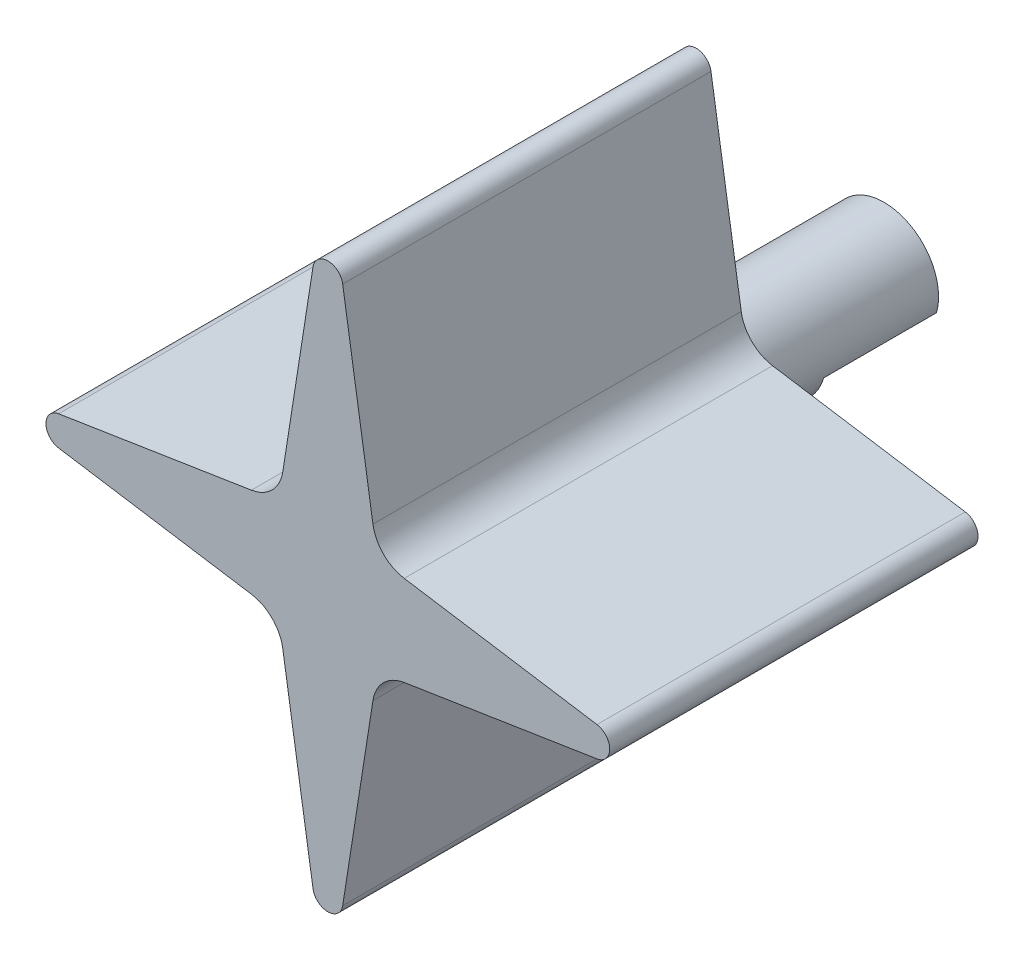
ISO-10303-21;
HEADER;
FILE_DESCRIPTION(('STEP AP214'),'2;1');
FILE_NAME('part.step','',(''),(''),'','','');
FILE_SCHEMA(('AUTOMOTIVE_DESIGN { 1 0 10303 214 1 1 1 1 }'));
ENDSEC;
DATA;
#1=APPLICATION_CONTEXT('core data for automotive mechanical design processes');
#2=APPLICATION_PROTOCOL_DEFINITION('international standard','automotive_design',2000,#1);
#3=PRODUCT_CONTEXT('',#1,'mechanical');
#4=PRODUCT('Part','Part','',(#3));
#5=PRODUCT_RELATED_PRODUCT_CATEGORY('part','',(#4));
#6=PRODUCT_DEFINITION_FORMATION('','',#4);
#7=PRODUCT_DEFINITION_CONTEXT('part definition',#1,'design');
#8=PRODUCT_DEFINITION('design','',#6,#7);
#9=PRODUCT_DEFINITION_SHAPE('','',#8);
#10=(LENGTH_UNIT() NAMED_UNIT(*) SI_UNIT(.MILLI.,.METRE.));
#11=(NAMED_UNIT(*) PLANE_ANGLE_UNIT() SI_UNIT($,.RADIAN.));
#12=(NAMED_UNIT(*) SI_UNIT($,.STERADIAN.) SOLID_ANGLE_UNIT());
#13=UNCERTAINTY_MEASURE_WITH_UNIT(LENGTH_MEASURE(1.E-05),#10,'distance_accuracy_value','');
#14=(GEOMETRIC_REPRESENTATION_CONTEXT(3) GLOBAL_UNCERTAINTY_ASSIGNED_CONTEXT((#13)) GLOBAL_UNIT_ASSIGNED_CONTEXT((#10,
#11,#12)) REPRESENTATION_CONTEXT('',''));
#15=CARTESIAN_POINT('',(0.,0.,0.));
#16=DIRECTION('',(0.,0.,1.));
#17=DIRECTION('',(1.,0.,0.));
#18=AXIS2_PLACEMENT_3D('',#15,#16,#17);
#19=CARTESIAN_POINT('',(-35.5,3.70975400848805E-13,49.));
#20=DIRECTION('',(0.,0.,-1.));
#21=DIRECTION('',(-1.,0.,0.));
#22=AXIS2_PLACEMENT_3D('',#19,#20,#21);
#23=CYLINDRICAL_SURFACE('',#22,2.);
#24=CARTESIAN_POINT('',(-35.5,3.70975400848805E-13,0.));
#25=DIRECTION('',(0.,0.,1.));
#26=DIRECTION('',(1.,0.,0.));
#27=AXIS2_PLACEMENT_3D('',#24,#25,#26);
#28=CIRCLE('',#27,2.);
#29=CARTESIAN_POINT('',(-35.8098591549296,-1.97585103287289,0.));
#30=VERTEX_POINT('',#29);
#31=CARTESIAN_POINT('',(-35.8098591549296,1.97585103287363,0.));
#32=VERTEX_POINT('',#31);
#33=EDGE_CURVE('E188',#30,#32,#28,.F.);
#34=ORIENTED_EDGE('',*,*,#33,.F.);
#35=DIRECTION('',(0.,0.,-1.));
#36=VECTOR('',#35,1.);
#37=CARTESIAN_POINT('',(-35.8098591549296,-1.97585103287289,49.));
#38=LINE('',#37,#36);
#39=CARTESIAN_POINT('',(-35.8098591549296,-1.97585103287289,49.));
#40=VERTEX_POINT('',#39);
#41=EDGE_CURVE('E269',#40,#30,#38,.T.);
#42=ORIENTED_EDGE('',*,*,#41,.F.);
#43=CARTESIAN_POINT('',(-35.5,3.70975400848805E-13,49.));
#44=DIRECTION('',(0.,0.,1.));
#45=DIRECTION('',(1.,0.,0.));
#46=AXIS2_PLACEMENT_3D('',#43,#44,#45);
#47=CIRCLE('',#46,2.);
#48=CARTESIAN_POINT('',(-35.8098591549296,1.97585103287363,49.));
#49=VERTEX_POINT('',#48);
#50=EDGE_CURVE('E189',#40,#49,#47,.F.);
#51=ORIENTED_EDGE('',*,*,#50,.T.);
#52=DIRECTION('',(0.,0.,-1.));
#53=VECTOR('',#52,1.);
#54=CARTESIAN_POINT('',(-35.8098591549296,1.97585103287363,49.));
#55=LINE('',#54,#53);
#56=EDGE_CURVE('E222',#49,#32,#55,.T.);
#57=ORIENTED_EDGE('',*,*,#56,.T.);
#58=EDGE_LOOP('',(#34,#42,#51,#57));
#59=FACE_BOUND('',#58,.T.);
#60=ADVANCED_FACE('F41',(#59),#23,.T.);
#61=CARTESIAN_POINT('',(-1.16197183098603,-7.40944137327481,49.));
#62=DIRECTION('',(-0.154929577464802,-0.987925516436628,0.));
#63=DIRECTION('',(0.987925516436628,-0.154929577464802,0.));
#64=AXIS2_PLACEMENT_3D('',#61,#62,#63);
#65=PLANE('',#64);
#66=DIRECTION('',(-0.987925516436628,0.154929577464802,0.));
#67=VECTOR('',#66,1.);
#68=CARTESIAN_POINT('',(-1.16197183098603,-7.40944137327481,0.));
#69=LINE('',#68,#67);
#70=CARTESIAN_POINT('',(-10.1628717218579,-5.99789202699855,0.));
#71=VERTEX_POINT('',#70);
#72=EDGE_CURVE('E225',#71,#30,#69,.T.);
#73=ORIENTED_EDGE('',*,*,#72,.F.);
#74=DIRECTION('',(0.,0.,-1.));
#75=VECTOR('',#74,1.);
#76=CARTESIAN_POINT('',(-10.1628717218579,-5.99789202699855,49.));
#77=LINE('',#76,#75);
#78=CARTESIAN_POINT('',(-10.1628717218579,-5.99789202699855,49.));
#79=VERTEX_POINT('',#78);
#80=EDGE_CURVE('E280',#71,#79,#77,.F.);
#81=ORIENTED_EDGE('',*,*,#80,.T.);
#82=DIRECTION('',(-0.987925516436628,0.154929577464802,0.));
#83=VECTOR('',#82,1.);
#84=CARTESIAN_POINT('',(-1.16197183098603,-7.40944137327481,49.));
#85=LINE('',#84,#83);
#86=EDGE_CURVE('E192',#79,#40,#85,.T.);
#87=ORIENTED_EDGE('',*,*,#86,.T.);
#88=ORIENTED_EDGE('',*,*,#41,.T.);
#89=EDGE_LOOP('',(#73,#81,#87,#88));
#90=FACE_BOUND('',#89,.T.);
#91=ADVANCED_FACE('F353',(#90),#65,.T.);
#92=CARTESIAN_POINT('',(-7.40944137327484,-1.16197183098591,49.));
#93=DIRECTION('',(-0.987925516436631,-0.154929577464785,0.));
#94=DIRECTION('',(0.154929577464785,-0.987925516436631,0.));
#95=AXIS2_PLACEMENT_3D('',#92,#93,#94);
#96=PLANE('',#95);
#97=DIRECTION('',(-0.154929577464785,0.987925516436631,0.));
#98=VECTOR('',#97,1.);
#99=CARTESIAN_POINT('',(-7.40944137327484,-1.16197183098591,49.));
#100=LINE('',#99,#98);
#101=CARTESIAN_POINT('',(-1.97585103287351,-35.8098591549296,49.));
#102=VERTEX_POINT('',#101);
#103=CARTESIAN_POINT('',(-5.99789202699874,-10.1628717218578,49.));
#104=VERTEX_POINT('',#103);
#105=EDGE_CURVE('E195',#102,#104,#100,.T.);
#106=ORIENTED_EDGE('',*,*,#105,.T.);
#107=DIRECTION('',(0.,0.,-1.));
#108=VECTOR('',#107,1.);
#109=CARTESIAN_POINT('',(-5.99789202699874,-10.1628717218578,0.));
#110=LINE('',#109,#108);
#111=CARTESIAN_POINT('',(-5.99789202699874,-10.1628717218578,0.));
#112=VERTEX_POINT('',#111);
#113=EDGE_CURVE('E277',#104,#112,#110,.T.);
#114=ORIENTED_EDGE('',*,*,#113,.T.);
#115=DIRECTION('',(-0.154929577464785,0.987925516436631,0.));
#116=VECTOR('',#115,1.);
#117=CARTESIAN_POINT('',(-7.40944137327484,-1.16197183098591,0.));
#118=LINE('',#117,#116);
#119=CARTESIAN_POINT('',(-1.97585103287351,-35.8098591549296,0.));
#120=VERTEX_POINT('',#119);
#121=EDGE_CURVE('E227',#120,#112,#118,.T.);
#122=ORIENTED_EDGE('',*,*,#121,.F.);
#123=DIRECTION('',(0.,0.,-1.));
#124=VECTOR('',#123,1.);
#125=CARTESIAN_POINT('',(-1.97585103287351,-35.8098591549296,49.));
#126=LINE('',#125,#124);
#127=EDGE_CURVE('E267',#102,#120,#126,.T.);
#128=ORIENTED_EDGE('',*,*,#127,.F.);
#129=EDGE_LOOP('',(#106,#114,#122,#128));
#130=FACE_BOUND('',#129,.T.);
#131=ADVANCED_FACE('F345',(#130),#96,.T.);
#132=CARTESIAN_POINT('',(-2.46160451581886E-13,-35.5,49.));
#133=DIRECTION('',(0.,0.,-1.));
#134=DIRECTION('',(-1.,0.,0.));
#135=AXIS2_PLACEMENT_3D('',#132,#133,#134);
#136=CYLINDRICAL_SURFACE('',#135,2.);
#137=CARTESIAN_POINT('',(-2.46160451581886E-13,-35.5,0.));
#138=DIRECTION('',(0.,0.,1.));
#139=DIRECTION('',(1.,0.,0.));
#140=AXIS2_PLACEMENT_3D('',#137,#138,#139);
#141=CIRCLE('',#140,2.);
#142=CARTESIAN_POINT('',(1.97585103287301,-35.8098591549296,0.));
#143=VERTEX_POINT('',#142);
#144=EDGE_CURVE('E230',#143,#120,#141,.F.);
#145=ORIENTED_EDGE('',*,*,#144,.F.);
#146=DIRECTION('',(0.,0.,-1.));
#147=VECTOR('',#146,1.);
#148=CARTESIAN_POINT('',(1.97585103287301,-35.8098591549296,49.));
#149=LINE('',#148,#147);
#150=CARTESIAN_POINT('',(1.97585103287301,-35.8098591549296,49.));
#151=VERTEX_POINT('',#150);
#152=EDGE_CURVE('E264',#151,#143,#149,.T.);
#153=ORIENTED_EDGE('',*,*,#152,.F.);
#154=CARTESIAN_POINT('',(-2.46160451581886E-13,-35.5,49.));
#155=DIRECTION('',(0.,0.,1.));
#156=DIRECTION('',(1.,0.,0.));
#157=AXIS2_PLACEMENT_3D('',#154,#155,#156);
#158=CIRCLE('',#157,2.);
#159=EDGE_CURVE('E198',#151,#102,#158,.F.);
#160=ORIENTED_EDGE('',*,*,#159,.T.);
#161=ORIENTED_EDGE('',*,*,#127,.T.);
#162=EDGE_LOOP('',(#145,#153,#160,#161));
#163=FACE_BOUND('',#162,.T.);
#164=ADVANCED_FACE('F341',(#163),#136,.T.);
#165=CARTESIAN_POINT('',(7.4094413732741,-1.16197183098573,49.));
#166=DIRECTION('',(0.987925516436632,-0.154929577464778,0.));
#167=DIRECTION('',(0.154929577464778,0.987925516436632,0.));
#168=AXIS2_PLACEMENT_3D('',#165,#166,#167);
#169=PLANE('',#168);
#170=DIRECTION('',(-0.154929577464778,-0.987925516436632,0.));
#171=VECTOR('',#170,1.);
#172=CARTESIAN_POINT('',(7.4094413732741,-1.16197183098573,0.));
#173=LINE('',#172,#171);
#174=CARTESIAN_POINT('',(5.99789202699803,-10.1628717218578,0.));
#175=VERTEX_POINT('',#174);
#176=EDGE_CURVE('E233',#175,#143,#173,.T.);
#177=ORIENTED_EDGE('',*,*,#176,.F.);
#178=DIRECTION('',(0.,0.,-1.));
#179=VECTOR('',#178,1.);
#180=CARTESIAN_POINT('',(5.99789202699803,-10.1628717218578,49.));
#181=LINE('',#180,#179);
#182=CARTESIAN_POINT('',(5.99789202699803,-10.1628717218578,49.));
#183=VERTEX_POINT('',#182);
#184=EDGE_CURVE('E285',#175,#183,#181,.F.);
#185=ORIENTED_EDGE('',*,*,#184,.T.);
#186=DIRECTION('',(-0.154929577464778,-0.987925516436632,0.));
#187=VECTOR('',#186,1.);
#188=CARTESIAN_POINT('',(7.4094413732741,-1.16197183098573,49.));
#189=LINE('',#188,#187);
#190=EDGE_CURVE('E201',#183,#151,#189,.T.);
#191=ORIENTED_EDGE('',*,*,#190,.T.);
#192=ORIENTED_EDGE('',*,*,#152,.T.);
#193=EDGE_LOOP('',(#177,#185,#191,#192));
#194=FACE_BOUND('',#193,.T.);
#195=ADVANCED_FACE('F335',(#194),#169,.T.);
#196=CARTESIAN_POINT('',(1.16197183098583,-7.40944137327457,49.));
#197=DIRECTION('',(0.15492957746478,-0.987925516436631,0.));
#198=DIRECTION('',(0.987925516436631,0.15492957746478,0.));
#199=AXIS2_PLACEMENT_3D('',#196,#197,#198);
#200=PLANE('',#199);
#201=DIRECTION('',(-0.987925516436631,-0.15492957746478,0.));
#202=VECTOR('',#201,1.);
#203=CARTESIAN_POINT('',(1.16197183098583,-7.40944137327457,49.));
#204=LINE('',#203,#202);
#205=CARTESIAN_POINT('',(35.8098591549296,-1.97585103287339,49.));
#206=VERTEX_POINT('',#205);
#207=CARTESIAN_POINT('',(10.1628717218573,-5.99789202699857,49.));
#208=VERTEX_POINT('',#207);
#209=EDGE_CURVE('E203',#206,#208,#204,.T.);
#210=ORIENTED_EDGE('',*,*,#209,.T.);
#211=DIRECTION('',(0.,0.,-1.));
#212=VECTOR('',#211,1.);
#213=CARTESIAN_POINT('',(10.1628717218573,-5.99789202699857,0.));
#214=LINE('',#213,#212);
#215=CARTESIAN_POINT('',(10.1628717218573,-5.99789202699857,0.));
#216=VERTEX_POINT('',#215);
#217=EDGE_CURVE('E282',#208,#216,#214,.T.);
#218=ORIENTED_EDGE('',*,*,#217,.T.);
#219=DIRECTION('',(-0.987925516436631,-0.15492957746478,0.));
#220=VECTOR('',#219,1.);
#221=CARTESIAN_POINT('',(1.16197183098583,-7.40944137327457,0.));
#222=LINE('',#221,#220);
#223=CARTESIAN_POINT('',(35.8098591549296,-1.97585103287339,0.));
#224=VERTEX_POINT('',#223);
#225=EDGE_CURVE('E235',#224,#216,#222,.T.);
#226=ORIENTED_EDGE('',*,*,#225,.F.);
#227=DIRECTION('',(0.,0.,-1.));
#228=VECTOR('',#227,1.);
#229=CARTESIAN_POINT('',(35.8098591549296,-1.97585103287339,49.));
#230=LINE('',#229,#228);
#231=EDGE_CURVE('E262',#206,#224,#230,.T.);
#232=ORIENTED_EDGE('',*,*,#231,.F.);
#233=EDGE_LOOP('',(#210,#218,#226,#232));
#234=FACE_BOUND('',#233,.T.);
#235=ADVANCED_FACE('F326',(#234),#200,.T.);
#236=CARTESIAN_POINT('',(35.5,-1.25682311004908E-13,49.));
#237=DIRECTION('',(0.,0.,-1.));
#238=DIRECTION('',(-1.,0.,0.));
#239=AXIS2_PLACEMENT_3D('',#236,#237,#238);
#240=CYLINDRICAL_SURFACE('',#239,2.);
#241=CARTESIAN_POINT('',(35.5,-1.25682311004908E-13,0.));
#242=DIRECTION('',(0.,0.,1.));
#243=DIRECTION('',(1.,0.,0.));
#244=AXIS2_PLACEMENT_3D('',#241,#242,#243);
#245=CIRCLE('',#244,2.);
#246=CARTESIAN_POINT('',(35.8098591549296,1.97585103287313,0.));
#247=VERTEX_POINT('',#246);
#248=EDGE_CURVE('E238',#247,#224,#245,.F.);
#249=ORIENTED_EDGE('',*,*,#248,.F.);
#250=DIRECTION('',(0.,0.,-1.));
#251=VECTOR('',#250,1.);
#252=CARTESIAN_POINT('',(35.8098591549296,1.97585103287313,49.));
#253=LINE('',#252,#251);
#254=CARTESIAN_POINT('',(35.8098591549296,1.97585103287313,49.));
#255=VERTEX_POINT('',#254);
#256=EDGE_CURVE('E259',#255,#247,#253,.T.);
#257=ORIENTED_EDGE('',*,*,#256,.F.);
#258=CARTESIAN_POINT('',(35.5,-1.25682311004908E-13,49.));
#259=DIRECTION('',(0.,0.,1.));
#260=DIRECTION('',(1.,0.,0.));
#261=AXIS2_PLACEMENT_3D('',#258,#259,#260);
#262=CIRCLE('',#261,2.);
#263=EDGE_CURVE('E206',#255,#206,#262,.F.);
#264=ORIENTED_EDGE('',*,*,#263,.T.);
#265=ORIENTED_EDGE('',*,*,#231,.T.);
#266=EDGE_LOOP('',(#249,#257,#264,#265));
#267=FACE_BOUND('',#266,.T.);
#268=ADVANCED_FACE('F322',(#267),#240,.T.);
#269=CARTESIAN_POINT('',(1.1619718309859,7.4094413732746,49.));
#270=DIRECTION('',(0.154929577464789,0.98792551643663,0.));
#271=DIRECTION('',(-0.98792551643663,0.154929577464789,0.));
#272=AXIS2_PLACEMENT_3D('',#269,#270,#271);
#273=PLANE('',#272);
#274=DIRECTION('',(0.98792551643663,-0.154929577464789,0.));
#275=VECTOR('',#274,1.);
#276=CARTESIAN_POINT('',(1.1619718309859,7.4094413732746,0.));
#277=LINE('',#276,#275);
#278=CARTESIAN_POINT('',(10.1628717218578,5.99789202699846,0.));
#279=VERTEX_POINT('',#278);
#280=EDGE_CURVE('E241',#279,#247,#277,.T.);
#281=ORIENTED_EDGE('',*,*,#280,.F.);
#282=DIRECTION('',(0.,0.,-1.));
#283=VECTOR('',#282,1.);
#284=CARTESIAN_POINT('',(10.1628717218578,5.99789202699846,49.));
#285=LINE('',#284,#283);
#286=CARTESIAN_POINT('',(10.1628717218578,5.99789202699846,49.));
#287=VERTEX_POINT('',#286);
#288=EDGE_CURVE('E64',#279,#287,#285,.F.);
#289=ORIENTED_EDGE('',*,*,#288,.T.);
#290=DIRECTION('',(0.98792551643663,-0.154929577464789,0.));
#291=VECTOR('',#290,1.);
#292=CARTESIAN_POINT('',(1.1619718309859,7.4094413732746,49.));
#293=LINE('',#292,#291);
#294=EDGE_CURVE('E209',#287,#255,#293,.T.);
#295=ORIENTED_EDGE('',*,*,#294,.T.);
#296=ORIENTED_EDGE('',*,*,#256,.T.);
#297=EDGE_LOOP('',(#281,#289,#295,#296));
#298=FACE_BOUND('',#297,.T.);
#299=ADVANCED_FACE('F318',(#298),#273,.T.);
#300=CARTESIAN_POINT('',(7.40944137327472,1.16197183098592,49.));
#301=DIRECTION('',(0.98792551643663,0.154929577464789,0.));
#302=DIRECTION('',(-0.154929577464789,0.98792551643663,0.));
#303=AXIS2_PLACEMENT_3D('',#300,#301,#302);
#304=PLANE('',#303);
#305=DIRECTION('',(0.154929577464789,-0.98792551643663,0.));
#306=VECTOR('',#305,1.);
#307=CARTESIAN_POINT('',(7.40944137327472,1.16197183098592,49.));
#308=LINE('',#307,#306);
#309=CARTESIAN_POINT('',(1.97585103287326,35.8098591549296,49.));
#310=VERTEX_POINT('',#309);
#311=CARTESIAN_POINT('',(5.9978920269986,10.1628717218577,49.));
#312=VERTEX_POINT('',#311);
#313=EDGE_CURVE('E211',#310,#312,#308,.T.);
#314=ORIENTED_EDGE('',*,*,#313,.T.);
#315=DIRECTION('',(0.,0.,-1.));
#316=VECTOR('',#315,1.);
#317=CARTESIAN_POINT('',(5.9978920269986,10.1628717218577,0.));
#318=LINE('',#317,#316);
#319=CARTESIAN_POINT('',(5.9978920269986,10.1628717218577,0.));
#320=VERTEX_POINT('',#319);
#321=EDGE_CURVE('E287',#312,#320,#318,.T.);
#322=ORIENTED_EDGE('',*,*,#321,.T.);
#323=DIRECTION('',(0.154929577464789,-0.98792551643663,0.));
#324=VECTOR('',#323,1.);
#325=CARTESIAN_POINT('',(7.40944137327472,1.16197183098592,0.));
#326=LINE('',#325,#324);
#327=CARTESIAN_POINT('',(1.97585103287326,35.8098591549296,0.));
#328=VERTEX_POINT('',#327);
#329=EDGE_CURVE('E243',#328,#320,#326,.T.);
#330=ORIENTED_EDGE('',*,*,#329,.F.);
#331=DIRECTION('',(0.,0.,-1.));
#332=VECTOR('',#331,1.);
#333=CARTESIAN_POINT('',(1.97585103287326,35.8098591549296,49.));
#334=LINE('',#333,#332);
#335=EDGE_CURVE('E257',#310,#328,#334,.T.);
#336=ORIENTED_EDGE('',*,*,#335,.F.);
#337=EDGE_LOOP('',(#314,#322,#330,#336));
#338=FACE_BOUND('',#337,.T.);
#339=ADVANCED_FACE('F314',(#338),#304,.T.);
#340=CARTESIAN_POINT('',(0.,35.5,49.));
#341=DIRECTION('',(0.,0.,-1.));
#342=DIRECTION('',(-1.,0.,0.));
#343=AXIS2_PLACEMENT_3D('',#340,#341,#342);
#344=CYLINDRICAL_SURFACE('',#343,2.);
#345=CARTESIAN_POINT('',(0.,35.5,0.));
#346=DIRECTION('',(0.,0.,1.));
#347=DIRECTION('',(1.,0.,0.));
#348=AXIS2_PLACEMENT_3D('',#345,#346,#347);
#349=CIRCLE('',#348,2.);
#350=CARTESIAN_POINT('',(-1.97585103287326,35.8098591549296,0.));
#351=VERTEX_POINT('',#350);
#352=EDGE_CURVE('E246',#351,#328,#349,.F.);
#353=ORIENTED_EDGE('',*,*,#352,.F.);
#354=DIRECTION('',(0.,0.,-1.));
#355=VECTOR('',#354,1.);
#356=CARTESIAN_POINT('',(-1.97585103287326,35.8098591549296,49.));
#357=LINE('',#356,#355);
#358=CARTESIAN_POINT('',(-1.97585103287326,35.8098591549296,49.));
#359=VERTEX_POINT('',#358);
#360=EDGE_CURVE('E254',#359,#351,#357,.T.);
#361=ORIENTED_EDGE('',*,*,#360,.F.);
#362=CARTESIAN_POINT('',(0.,35.5,49.));
#363=DIRECTION('',(0.,0.,1.));
#364=DIRECTION('',(1.,0.,0.));
#365=AXIS2_PLACEMENT_3D('',#362,#363,#364);
#366=CIRCLE('',#365,2.);
#367=EDGE_CURVE('E214',#359,#310,#366,.F.);
#368=ORIENTED_EDGE('',*,*,#367,.T.);
#369=ORIENTED_EDGE('',*,*,#335,.T.);
#370=EDGE_LOOP('',(#353,#361,#368,#369));
#371=FACE_BOUND('',#370,.T.);
#372=ADVANCED_FACE('F373',(#371),#344,.T.);
#373=CARTESIAN_POINT('',(-7.40944137327472,1.16197183098591,49.));
#374=DIRECTION('',(-0.98792551643663,0.154929577464789,0.));
#375=DIRECTION('',(-0.154929577464789,-0.98792551643663,0.));
#376=AXIS2_PLACEMENT_3D('',#373,#374,#375);
#377=PLANE('',#376);
#378=DIRECTION('',(0.154929577464789,0.98792551643663,0.));
#379=VECTOR('',#378,1.);
#380=CARTESIAN_POINT('',(-7.40944137327472,1.16197183098591,0.));
#381=LINE('',#380,#379);
#382=CARTESIAN_POINT('',(-5.99789202699857,10.1628717218579,0.));
#383=VERTEX_POINT('',#382);
#384=EDGE_CURVE('E249',#383,#351,#381,.T.);
#385=ORIENTED_EDGE('',*,*,#384,.F.);
#386=DIRECTION('',(0.,0.,-1.));
#387=VECTOR('',#386,1.);
#388=CARTESIAN_POINT('',(-5.99789202699857,10.1628717218579,49.));
#389=LINE('',#388,#387);
#390=CARTESIAN_POINT('',(-5.99789202699857,10.1628717218579,49.));
#391=VERTEX_POINT('',#390);
#392=EDGE_CURVE('E275',#383,#391,#389,.F.);
#393=ORIENTED_EDGE('',*,*,#392,.T.);
#394=DIRECTION('',(0.154929577464789,0.98792551643663,0.));
#395=VECTOR('',#394,1.);
#396=CARTESIAN_POINT('',(-7.40944137327472,1.16197183098591,49.));
#397=LINE('',#396,#395);
#398=EDGE_CURVE('E217',#391,#359,#397,.T.);
#399=ORIENTED_EDGE('',*,*,#398,.T.);
#400=ORIENTED_EDGE('',*,*,#360,.T.);
#401=EDGE_LOOP('',(#385,#393,#399,#400));
#402=FACE_BOUND('',#401,.T.);
#403=ADVANCED_FACE('F368',(#402),#377,.T.);
#404=CARTESIAN_POINT('',(-1.16197183098582,7.40944137327469,49.));
#405=DIRECTION('',(-0.154929577464777,0.987925516436632,0.));
#406=DIRECTION('',(-0.987925516436632,-0.154929577464777,0.));
#407=AXIS2_PLACEMENT_3D('',#404,#405,#406);
#408=PLANE('',#407);
#409=DIRECTION('',(0.987925516436632,0.154929577464777,0.));
#410=VECTOR('',#409,1.);
#411=CARTESIAN_POINT('',(-1.16197183098582,7.40944137327469,49.));
#412=LINE('',#411,#410);
#413=CARTESIAN_POINT('',(-10.1628717218578,5.99789202699864,49.));
#414=VERTEX_POINT('',#413);
#415=EDGE_CURVE('E219',#49,#414,#412,.T.);
#416=ORIENTED_EDGE('',*,*,#415,.T.);
#417=DIRECTION('',(0.,0.,-1.));
#418=VECTOR('',#417,1.);
#419=CARTESIAN_POINT('',(-10.1628717218578,5.99789202699864,0.));
#420=LINE('',#419,#418);
#421=CARTESIAN_POINT('',(-10.1628717218578,5.99789202699864,0.));
#422=VERTEX_POINT('',#421);
#423=EDGE_CURVE('E272',#414,#422,#420,.T.);
#424=ORIENTED_EDGE('',*,*,#423,.T.);
#425=DIRECTION('',(0.987925516436632,0.154929577464777,0.));
#426=VECTOR('',#425,1.);
#427=CARTESIAN_POINT('',(-1.16197183098582,7.40944137327469,0.));
#428=LINE('',#427,#426);
#429=EDGE_CURVE('E193',#32,#422,#428,.T.);
#430=ORIENTED_EDGE('',*,*,#429,.F.);
#431=ORIENTED_EDGE('',*,*,#56,.F.);
#432=EDGE_LOOP('',(#416,#424,#430,#431));
#433=FACE_BOUND('',#432,.T.);
#434=ADVANCED_FACE('F360',(#433),#408,.T.);
#435=CARTESIAN_POINT('',(0.,0.,49.));
#436=DIRECTION('',(0.,0.,1.));
#437=DIRECTION('',(1.,0.,0.));
#438=AXIS2_PLACEMENT_3D('',#435,#436,#437);
#439=PLANE('',#438);
#440=ORIENTED_EDGE('',*,*,#50,.F.);
#441=ORIENTED_EDGE('',*,*,#86,.F.);
#442=CARTESIAN_POINT('',(-10.9375196091819,-10.9375196091817,49.));
#443=DIRECTION('',(0.,0.,1.));
#444=DIRECTION('',(1.,0.,0.));
#445=AXIS2_PLACEMENT_3D('',#442,#443,#444);
#446=CIRCLE('',#445,5.);
#447=EDGE_CURVE('E297',#79,#104,#446,.F.);
#448=ORIENTED_EDGE('',*,*,#447,.T.);
#449=ORIENTED_EDGE('',*,*,#105,.F.);
#450=ORIENTED_EDGE('',*,*,#159,.F.);
#451=ORIENTED_EDGE('',*,*,#190,.F.);
#452=CARTESIAN_POINT('',(10.9375196091812,-10.9375196091817,49.));
#453=DIRECTION('',(0.,0.,1.));
#454=DIRECTION('',(1.,0.,0.));
#455=AXIS2_PLACEMENT_3D('',#452,#453,#454);
#456=CIRCLE('',#455,5.);
#457=EDGE_CURVE('E301',#183,#208,#456,.F.);
#458=ORIENTED_EDGE('',*,*,#457,.T.);
#459=ORIENTED_EDGE('',*,*,#209,.F.);
#460=ORIENTED_EDGE('',*,*,#263,.F.);
#461=ORIENTED_EDGE('',*,*,#294,.F.);
#462=CARTESIAN_POINT('',(10.9375196091818,10.9375196091816,49.));
#463=DIRECTION('',(0.,0.,1.));
#464=DIRECTION('',(1.,0.,0.));
#465=AXIS2_PLACEMENT_3D('',#462,#463,#464);
#466=CIRCLE('',#465,5.);
#467=EDGE_CURVE('E49',#287,#312,#466,.F.);
#468=ORIENTED_EDGE('',*,*,#467,.T.);
#469=ORIENTED_EDGE('',*,*,#313,.F.);
#470=ORIENTED_EDGE('',*,*,#367,.F.);
#471=ORIENTED_EDGE('',*,*,#398,.F.);
#472=CARTESIAN_POINT('',(-10.9375196091817,10.9375196091818,49.));
#473=DIRECTION('',(0.,0.,1.));
#474=DIRECTION('',(1.,0.,0.));
#475=AXIS2_PLACEMENT_3D('',#472,#473,#474);
#476=CIRCLE('',#475,5.);
#477=EDGE_CURVE('E293',#391,#414,#476,.F.);
#478=ORIENTED_EDGE('',*,*,#477,.T.);
#479=ORIENTED_EDGE('',*,*,#415,.F.);
#480=EDGE_LOOP('',(#440,#441,#448,#449,#450,#451,#458,#459,#460,#461,#468,#469,#470,#471,#478,#479));
#481=FACE_BOUND('',#480,.T.);
#482=ADVANCED_FACE('F308',(#481),#439,.T.);
#483=CARTESIAN_POINT('',(0.,0.,0.));
#484=DIRECTION('',(0.,0.,1.));
#485=DIRECTION('',(1.,0.,0.));
#486=AXIS2_PLACEMENT_3D('',#483,#484,#485);
#487=PLANE('',#486);
#488=CARTESIAN_POINT('',(-2.56739074444567E-13,-2.84494650060196E-13,0.));
#489=DIRECTION('',(0.,0.,1.));
#490=DIRECTION('',(1.,0.,0.));
#491=AXIS2_PLACEMENT_3D('',#488,#489,#490);
#492=CIRCLE('',#491,7.25);
#493=CARTESIAN_POINT('',(7.24999999999974,-2.84494650060196E-13,0.));
#494=VERTEX_POINT('',#493);
#495=EDGE_CURVE('E11',#494,#494,#492,.F.);
#496=ORIENTED_EDGE('',*,*,#495,.F.);
#497=EDGE_LOOP('',(#496));
#498=FACE_BOUND('',#497,.T.);
#499=ORIENTED_EDGE('',*,*,#33,.T.);
#500=ORIENTED_EDGE('',*,*,#429,.T.);
#501=CARTESIAN_POINT('',(-10.9375196091817,10.9375196091818,0.));
#502=DIRECTION('',(0.,0.,1.));
#503=DIRECTION('',(1.,0.,0.));
#504=AXIS2_PLACEMENT_3D('',#501,#502,#503);
#505=CIRCLE('',#504,5.);
#506=EDGE_CURVE('E291',#422,#383,#505,.T.);
#507=ORIENTED_EDGE('',*,*,#506,.T.);
#508=ORIENTED_EDGE('',*,*,#384,.T.);
#509=ORIENTED_EDGE('',*,*,#352,.T.);
#510=ORIENTED_EDGE('',*,*,#329,.T.);
#511=CARTESIAN_POINT('',(10.9375196091818,10.9375196091816,0.));
#512=DIRECTION('',(0.,0.,1.));
#513=DIRECTION('',(1.,0.,0.));
#514=AXIS2_PLACEMENT_3D('',#511,#512,#513);
#515=CIRCLE('',#514,5.);
#516=EDGE_CURVE('E303',#320,#279,#515,.T.);
#517=ORIENTED_EDGE('',*,*,#516,.T.);
#518=ORIENTED_EDGE('',*,*,#280,.T.);
#519=ORIENTED_EDGE('',*,*,#248,.T.);
#520=ORIENTED_EDGE('',*,*,#225,.T.);
#521=CARTESIAN_POINT('',(10.9375196091812,-10.9375196091817,0.));
#522=DIRECTION('',(0.,0.,1.));
#523=DIRECTION('',(1.,0.,0.));
#524=AXIS2_PLACEMENT_3D('',#521,#522,#523);
#525=CIRCLE('',#524,5.);
#526=EDGE_CURVE('E299',#216,#175,#525,.T.);
#527=ORIENTED_EDGE('',*,*,#526,.T.);
#528=ORIENTED_EDGE('',*,*,#176,.T.);
#529=ORIENTED_EDGE('',*,*,#144,.T.);
#530=ORIENTED_EDGE('',*,*,#121,.T.);
#531=CARTESIAN_POINT('',(-10.9375196091819,-10.9375196091817,0.));
#532=DIRECTION('',(0.,0.,1.));
#533=DIRECTION('',(1.,0.,0.));
#534=AXIS2_PLACEMENT_3D('',#531,#532,#533);
#535=CIRCLE('',#534,5.);
#536=EDGE_CURVE('E295',#112,#71,#535,.T.);
#537=ORIENTED_EDGE('',*,*,#536,.T.);
#538=ORIENTED_EDGE('',*,*,#72,.T.);
#539=EDGE_LOOP('',(#499,#500,#507,#508,#509,#510,#517,#518,#519,#520,#527,#528,#529,#530,#537,#538));
#540=FACE_BOUND('',#539,.T.);
#541=ADVANCED_FACE('F317',(#498,#540),#487,.F.);
#542=CARTESIAN_POINT('',(-10.9375196091817,10.9375196091818,49.));
#543=DIRECTION('',(0.,0.,1.));
#544=DIRECTION('',(1.,0.,0.));
#545=AXIS2_PLACEMENT_3D('',#542,#543,#544);
#546=CYLINDRICAL_SURFACE('',#545,5.);
#547=ORIENTED_EDGE('',*,*,#477,.F.);
#548=ORIENTED_EDGE('',*,*,#392,.F.);
#549=ORIENTED_EDGE('',*,*,#506,.F.);
#550=ORIENTED_EDGE('',*,*,#423,.F.);
#551=EDGE_LOOP('',(#547,#548,#549,#550));
#552=FACE_BOUND('',#551,.T.);
#553=ADVANCED_FACE('F364',(#552),#546,.F.);
#554=CARTESIAN_POINT('',(-10.9375196091819,-10.9375196091817,49.));
#555=DIRECTION('',(0.,0.,1.));
#556=DIRECTION('',(1.,0.,0.));
#557=AXIS2_PLACEMENT_3D('',#554,#555,#556);
#558=CYLINDRICAL_SURFACE('',#557,5.);
#559=ORIENTED_EDGE('',*,*,#447,.F.);
#560=ORIENTED_EDGE('',*,*,#80,.F.);
#561=ORIENTED_EDGE('',*,*,#536,.F.);
#562=ORIENTED_EDGE('',*,*,#113,.F.);
#563=EDGE_LOOP('',(#559,#560,#561,#562));
#564=FACE_BOUND('',#563,.T.);
#565=ADVANCED_FACE('F349',(#564),#558,.F.);
#566=CARTESIAN_POINT('',(10.9375196091812,-10.9375196091817,49.));
#567=DIRECTION('',(0.,0.,1.));
#568=DIRECTION('',(1.,0.,0.));
#569=AXIS2_PLACEMENT_3D('',#566,#567,#568);
#570=CYLINDRICAL_SURFACE('',#569,5.);
#571=ORIENTED_EDGE('',*,*,#457,.F.);
#572=ORIENTED_EDGE('',*,*,#184,.F.);
#573=ORIENTED_EDGE('',*,*,#526,.F.);
#574=ORIENTED_EDGE('',*,*,#217,.F.);
#575=EDGE_LOOP('',(#571,#572,#573,#574));
#576=FACE_BOUND('',#575,.T.);
#577=ADVANCED_FACE('F331',(#576),#570,.F.);
#578=CARTESIAN_POINT('',(10.9375196091818,10.9375196091816,49.));
#579=DIRECTION('',(0.,0.,1.));
#580=DIRECTION('',(1.,0.,0.));
#581=AXIS2_PLACEMENT_3D('',#578,#579,#580);
#582=CYLINDRICAL_SURFACE('',#581,5.);
#583=ORIENTED_EDGE('',*,*,#467,.F.);
#584=ORIENTED_EDGE('',*,*,#288,.F.);
#585=ORIENTED_EDGE('',*,*,#516,.F.);
#586=ORIENTED_EDGE('',*,*,#321,.F.);
#587=EDGE_LOOP('',(#583,#584,#585,#586));
#588=FACE_BOUND('',#587,.T.);
#589=ADVANCED_FACE('F43',(#588),#582,.F.);
#590=CARTESIAN_POINT('',(-2.56739074444567E-13,-2.84494650060196E-13,-25.));
#591=DIRECTION('',(0.,0.,1.));
#592=DIRECTION('',(1.,0.,0.));
#593=AXIS2_PLACEMENT_3D('',#590,#591,#592);
#594=CYLINDRICAL_SURFACE('',#593,7.25);
#595=CARTESIAN_POINT('',(-2.56739074444567E-13,-2.84494650060196E-13,-25.));
#596=DIRECTION('',(0.,0.,-1.));
#597=DIRECTION('',(-1.,0.,0.));
#598=AXIS2_PLACEMENT_3D('',#595,#596,#597);
#599=CIRCLE('',#598,7.25);
#600=CARTESIAN_POINT('',(-6.96867993238352,-2.,-25.));
#601=VERTEX_POINT('',#600);
#602=CARTESIAN_POINT('',(6.968679932383,-2.,-25.));
#603=VERTEX_POINT('',#602);
#604=EDGE_CURVE('E182',#601,#603,#599,.T.);
#605=ORIENTED_EDGE('',*,*,#604,.F.);
#606=DIRECTION('',(0.,0.,-1.));
#607=VECTOR('',#606,1.);
#608=CARTESIAN_POINT('',(-6.96867993238352,-2.,-10.));
#609=LINE('',#608,#607);
#610=CARTESIAN_POINT('',(-6.96867993238352,-2.,-10.));
#611=VERTEX_POINT('',#610);
#612=EDGE_CURVE('E56',#611,#601,#609,.T.);
#613=ORIENTED_EDGE('',*,*,#612,.F.);
#614=CARTESIAN_POINT('',(-2.56739074444567E-13,-2.84494650060196E-13,-10.));
#615=DIRECTION('',(0.,0.,-1.));
#616=DIRECTION('',(-1.,0.,0.));
#617=AXIS2_PLACEMENT_3D('',#614,#615,#616);
#618=CIRCLE('',#617,7.25);
#619=CARTESIAN_POINT('',(6.968679932383,-2.,-10.));
#620=VERTEX_POINT('',#619);
#621=EDGE_CURVE('E168',#620,#611,#618,.T.);
#622=ORIENTED_EDGE('',*,*,#621,.F.);
#623=DIRECTION('',(0.,0.,-1.));
#624=VECTOR('',#623,1.);
#625=CARTESIAN_POINT('',(6.968679932383,-2.,-10.));
#626=LINE('',#625,#624);
#627=EDGE_CURVE('E176',#620,#603,#626,.T.);
#628=ORIENTED_EDGE('',*,*,#627,.T.);
#629=EDGE_LOOP('',(#605,#613,#622,#628));
#630=FACE_BOUND('',#629,.T.);
#631=ORIENTED_EDGE('',*,*,#495,.T.);
#632=EDGE_LOOP('',(#631));
#633=FACE_BOUND('',#632,.T.);
#634=ADVANCED_FACE('F179',(#630,#633),#594,.T.);
#635=CARTESIAN_POINT('',(-2.56739074444567E-13,-2.84494650060196E-13,-25.));
#636=DIRECTION('',(0.,0.,-1.));
#637=DIRECTION('',(-1.,0.,0.));
#638=AXIS2_PLACEMENT_3D('',#635,#636,#637);
#639=PLANE('',#638);
#640=DIRECTION('',(1.,0.,0.));
#641=VECTOR('',#640,1.);
#642=CARTESIAN_POINT('',(0.,-2.,-25.));
#643=LINE('',#642,#641);
#644=EDGE_CURVE('E173',#601,#603,#643,.T.);
#645=ORIENTED_EDGE('',*,*,#644,.F.);
#646=ORIENTED_EDGE('',*,*,#604,.T.);
#647=EDGE_LOOP('',(#645,#646));
#648=FACE_BOUND('',#647,.T.);
#649=ADVANCED_FACE('F403',(#648),#639,.T.);
#650=CARTESIAN_POINT('',(0.,-2.,-10.));
#651=DIRECTION('',(0.,1.,0.));
#652=DIRECTION('',(0.,0.,1.));
#653=AXIS2_PLACEMENT_3D('',#650,#651,#652);
#654=PLANE('',#653);
#655=ORIENTED_EDGE('',*,*,#644,.T.);
#656=ORIENTED_EDGE('',*,*,#627,.F.);
#657=DIRECTION('',(1.,0.,0.));
#658=VECTOR('',#657,1.);
#659=CARTESIAN_POINT('',(0.,-2.,-10.));
#660=LINE('',#659,#658);
#661=EDGE_CURVE('E170',#611,#620,#660,.T.);
#662=ORIENTED_EDGE('',*,*,#661,.F.);
#663=ORIENTED_EDGE('',*,*,#612,.T.);
#664=EDGE_LOOP('',(#655,#656,#662,#663));
#665=FACE_BOUND('',#664,.T.);
#666=ADVANCED_FACE('F175',(#665),#654,.F.);
#667=CARTESIAN_POINT('',(0.,0.,-10.));
#668=DIRECTION('',(0.,0.,-1.));
#669=DIRECTION('',(-1.,0.,0.));
#670=AXIS2_PLACEMENT_3D('',#667,#668,#669);
#671=PLANE('',#670);
#672=ORIENTED_EDGE('',*,*,#621,.T.);
#673=ORIENTED_EDGE('',*,*,#661,.T.);
#674=EDGE_LOOP('',(#672,#673));
#675=FACE_BOUND('',#674,.T.);
#676=ADVANCED_FACE('F169',(#675),#671,.T.);
#677=CLOSED_SHELL('',(#60,#91,#131,#164,#195,#235,#268,#299,#339,#372,#403,#434,#482,#541,#553,
#565,#577,#589,#634,#649,#666,#676));
#678=MANIFOLD_SOLID_BREP('B2',#677);
#679=ADVANCED_BREP_SHAPE_REPRESENTATION('',(#18,#678),#14);
#680=SHAPE_DEFINITION_REPRESENTATION(#9,#679);
ENDSEC;
END-ISO-10303-21;
